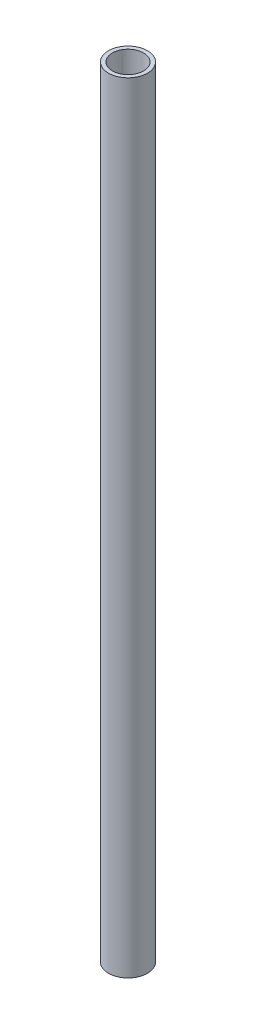
ISO-10303-21;
HEADER;
FILE_DESCRIPTION(('STEP AP214'),'2;1');
FILE_NAME('part.step','',(''),(''),'','','');
FILE_SCHEMA(('AUTOMOTIVE_DESIGN { 1 0 10303 214 1 1 1 1 }'));
ENDSEC;
DATA;
#1=APPLICATION_CONTEXT('core data for automotive mechanical design processes');
#2=APPLICATION_PROTOCOL_DEFINITION('international standard','automotive_design',2000,#1);
#3=PRODUCT_CONTEXT('',#1,'mechanical');
#4=PRODUCT('Part','Part','',(#3));
#5=PRODUCT_RELATED_PRODUCT_CATEGORY('part','',(#4));
#6=PRODUCT_DEFINITION_FORMATION('','',#4);
#7=PRODUCT_DEFINITION_CONTEXT('part definition',#1,'design');
#8=PRODUCT_DEFINITION('design','',#6,#7);
#9=PRODUCT_DEFINITION_SHAPE('','',#8);
#10=(LENGTH_UNIT() NAMED_UNIT(*) SI_UNIT(.MILLI.,.METRE.));
#11=(NAMED_UNIT(*) PLANE_ANGLE_UNIT() SI_UNIT($,.RADIAN.));
#12=(NAMED_UNIT(*) SI_UNIT($,.STERADIAN.) SOLID_ANGLE_UNIT());
#13=UNCERTAINTY_MEASURE_WITH_UNIT(LENGTH_MEASURE(1.E-05),#10,'distance_accuracy_value','');
#14=(GEOMETRIC_REPRESENTATION_CONTEXT(3) GLOBAL_UNCERTAINTY_ASSIGNED_CONTEXT((#13)) GLOBAL_UNIT_ASSIGNED_CONTEXT((#10,
#11,#12)) REPRESENTATION_CONTEXT('',''));
#15=CARTESIAN_POINT('',(0.,0.,0.));
#16=DIRECTION('',(0.,0.,1.));
#17=DIRECTION('',(1.,0.,0.));
#18=AXIS2_PLACEMENT_3D('',#15,#16,#17);
#19=CARTESIAN_POINT('',(0.,100.,0.));
#20=DIRECTION('',(0.,1.,0.));
#21=DIRECTION('',(0.,0.,1.));
#22=AXIS2_PLACEMENT_3D('',#19,#20,#21);
#23=PLANE('',#22);
#24=CARTESIAN_POINT('',(0.,100.,0.));
#25=DIRECTION('',(0.,1.,0.));
#26=DIRECTION('',(0.,0.,1.));
#27=AXIS2_PLACEMENT_3D('',#24,#25,#26);
#28=CIRCLE('',#27,2.5);
#29=CARTESIAN_POINT('',(0.,100.,2.5));
#30=VERTEX_POINT('',#29);
#31=EDGE_CURVE('E10',#30,#30,#28,.T.);
#32=ORIENTED_EDGE('',*,*,#31,.T.);
#33=EDGE_LOOP('',(#32));
#34=FACE_BOUND('',#33,.T.);
#35=CARTESIAN_POINT('',(0.,100.,0.));
#36=DIRECTION('',(0.,1.,0.));
#37=DIRECTION('',(0.,0.,1.));
#38=AXIS2_PLACEMENT_3D('',#35,#36,#37);
#39=CIRCLE('',#38,2.);
#40=CARTESIAN_POINT('',(0.,100.,2.));
#41=VERTEX_POINT('',#40);
#42=EDGE_CURVE('E50',#41,#41,#39,.T.);
#43=ORIENTED_EDGE('',*,*,#42,.F.);
#44=EDGE_LOOP('',(#43));
#45=FACE_BOUND('',#44,.T.);
#46=ADVANCED_FACE('F37',(#34,#45),#23,.T.);
#47=CARTESIAN_POINT('',(0.,0.,0.));
#48=DIRECTION('',(0.,1.,0.));
#49=DIRECTION('',(0.,0.,1.));
#50=AXIS2_PLACEMENT_3D('',#47,#48,#49);
#51=PLANE('',#50);
#52=CARTESIAN_POINT('',(0.,0.,0.));
#53=DIRECTION('',(0.,1.,0.));
#54=DIRECTION('',(0.,0.,1.));
#55=AXIS2_PLACEMENT_3D('',#52,#53,#54);
#56=CIRCLE('',#55,2.5);
#57=CARTESIAN_POINT('',(0.,0.,2.5));
#58=VERTEX_POINT('',#57);
#59=EDGE_CURVE('E41',#58,#58,#56,.T.);
#60=ORIENTED_EDGE('',*,*,#59,.F.);
#61=EDGE_LOOP('',(#60));
#62=FACE_BOUND('',#61,.T.);
#63=CARTESIAN_POINT('',(0.,0.,0.));
#64=DIRECTION('',(0.,1.,0.));
#65=DIRECTION('',(0.,0.,1.));
#66=AXIS2_PLACEMENT_3D('',#63,#64,#65);
#67=CIRCLE('',#66,2.);
#68=CARTESIAN_POINT('',(0.,0.,2.));
#69=VERTEX_POINT('',#68);
#70=EDGE_CURVE('E52',#69,#69,#67,.T.);
#71=ORIENTED_EDGE('',*,*,#70,.T.);
#72=EDGE_LOOP('',(#71));
#73=FACE_BOUND('',#72,.T.);
#74=ADVANCED_FACE('F64',(#62,#73),#51,.F.);
#75=CARTESIAN_POINT('',(0.,100.,0.));
#76=DIRECTION('',(0.,-1.,0.));
#77=DIRECTION('',(0.,0.,-1.));
#78=AXIS2_PLACEMENT_3D('',#75,#76,#77);
#79=CYLINDRICAL_SURFACE('',#78,2.5);
#80=ORIENTED_EDGE('',*,*,#31,.F.);
#81=EDGE_LOOP('',(#80));
#82=FACE_BOUND('',#81,.T.);
#83=ORIENTED_EDGE('',*,*,#59,.T.);
#84=EDGE_LOOP('',(#83));
#85=FACE_BOUND('',#84,.T.);
#86=ADVANCED_FACE('F39',(#82,#85),#79,.T.);
#87=CARTESIAN_POINT('',(0.,100.,0.));
#88=DIRECTION('',(0.,-1.,0.));
#89=DIRECTION('',(0.,0.,-1.));
#90=AXIS2_PLACEMENT_3D('',#87,#88,#89);
#91=CYLINDRICAL_SURFACE('',#90,2.);
#92=ORIENTED_EDGE('',*,*,#42,.T.);
#93=EDGE_LOOP('',(#92));
#94=FACE_BOUND('',#93,.T.);
#95=ORIENTED_EDGE('',*,*,#70,.F.);
#96=EDGE_LOOP('',(#95));
#97=FACE_BOUND('',#96,.T.);
#98=ADVANCED_FACE('F60',(#94,#97),#91,.F.);
#99=CLOSED_SHELL('',(#46,#74,#86,#98));
#100=MANIFOLD_SOLID_BREP('B2',#99);
#101=ADVANCED_BREP_SHAPE_REPRESENTATION('',(#18,#100),#14);
#102=SHAPE_DEFINITION_REPRESENTATION(#9,#101);
ENDSEC;
END-ISO-10303-21;
